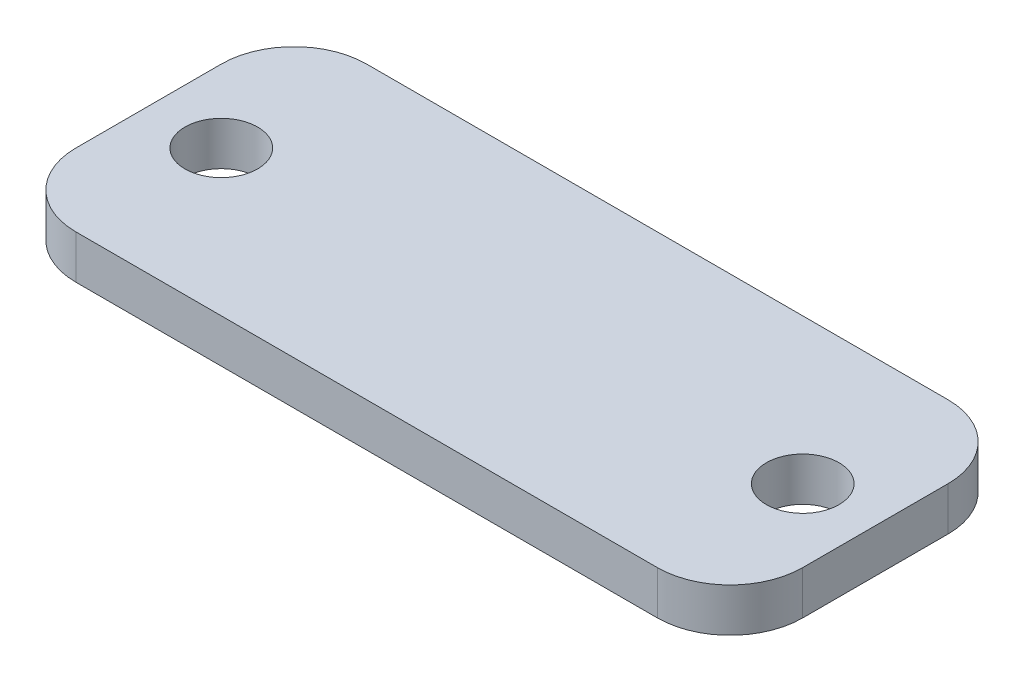
ISO-10303-21;
HEADER;
FILE_DESCRIPTION(('STEP AP214'),'2;1');
FILE_NAME('part.step','',(''),(''),'','','');
FILE_SCHEMA(('AUTOMOTIVE_DESIGN { 1 0 10303 214 1 1 1 1 }'));
ENDSEC;
DATA;
#1=APPLICATION_CONTEXT('core data for automotive mechanical design processes');
#2=APPLICATION_PROTOCOL_DEFINITION('international standard','automotive_design',2000,#1);
#3=PRODUCT_CONTEXT('',#1,'mechanical');
#4=PRODUCT('Part','Part','',(#3));
#5=PRODUCT_RELATED_PRODUCT_CATEGORY('part','',(#4));
#6=PRODUCT_DEFINITION_FORMATION('','',#4);
#7=PRODUCT_DEFINITION_CONTEXT('part definition',#1,'design');
#8=PRODUCT_DEFINITION('design','',#6,#7);
#9=PRODUCT_DEFINITION_SHAPE('','',#8);
#10=(LENGTH_UNIT() NAMED_UNIT(*) SI_UNIT(.MILLI.,.METRE.));
#11=(NAMED_UNIT(*) PLANE_ANGLE_UNIT() SI_UNIT($,.RADIAN.));
#12=(NAMED_UNIT(*) SI_UNIT($,.STERADIAN.) SOLID_ANGLE_UNIT());
#13=UNCERTAINTY_MEASURE_WITH_UNIT(LENGTH_MEASURE(1.E-05),#10,'distance_accuracy_value','');
#14=(GEOMETRIC_REPRESENTATION_CONTEXT(3) GLOBAL_UNCERTAINTY_ASSIGNED_CONTEXT((#13)) GLOBAL_UNIT_ASSIGNED_CONTEXT((#10,
#11,#12)) REPRESENTATION_CONTEXT('',''));
#15=CARTESIAN_POINT('',(0.,0.,0.));
#16=DIRECTION('',(0.,0.,1.));
#17=DIRECTION('',(1.,0.,0.));
#18=AXIS2_PLACEMENT_3D('',#15,#16,#17);
#19=CARTESIAN_POINT('',(0.,3.,0.));
#20=DIRECTION('',(0.,-1.,0.));
#21=DIRECTION('',(0.,0.,-1.));
#22=AXIS2_PLACEMENT_3D('',#19,#20,#21);
#23=PLANE('',#22);
#24=DIRECTION('',(0.,0.,1.));
#25=VECTOR('',#24,1.);
#26=CARTESIAN_POINT('',(-25.,3.,10.));
#27=LINE('',#26,#25);
#28=CARTESIAN_POINT('',(-25.,3.,-5.));
#29=VERTEX_POINT('',#28);
#30=CARTESIAN_POINT('',(-25.,3.,5.));
#31=VERTEX_POINT('',#30);
#32=EDGE_CURVE('E171',#29,#31,#27,.T.);
#33=ORIENTED_EDGE('',*,*,#32,.T.);
#34=CARTESIAN_POINT('',(-20.,3.,5.));
#35=DIRECTION('',(0.,-1.,0.));
#36=DIRECTION('',(0.,0.,-1.));
#37=AXIS2_PLACEMENT_3D('',#34,#35,#36);
#38=CIRCLE('',#37,5.);
#39=CARTESIAN_POINT('',(-20.,3.,10.));
#40=VERTEX_POINT('',#39);
#41=EDGE_CURVE('E148',#31,#40,#38,.F.);
#42=ORIENTED_EDGE('',*,*,#41,.T.);
#43=DIRECTION('',(1.,0.,0.));
#44=VECTOR('',#43,1.);
#45=CARTESIAN_POINT('',(-25.,3.,10.));
#46=LINE('',#45,#44);
#47=CARTESIAN_POINT('',(20.,3.,10.));
#48=VERTEX_POINT('',#47);
#49=EDGE_CURVE('E119',#40,#48,#46,.T.);
#50=ORIENTED_EDGE('',*,*,#49,.T.);
#51=CARTESIAN_POINT('',(20.,3.,5.));
#52=DIRECTION('',(0.,-1.,0.));
#53=DIRECTION('',(0.,0.,-1.));
#54=AXIS2_PLACEMENT_3D('',#51,#52,#53);
#55=CIRCLE('',#54,5.);
#56=CARTESIAN_POINT('',(25.,3.,5.));
#57=VERTEX_POINT('',#56);
#58=EDGE_CURVE('E144',#48,#57,#55,.F.);
#59=ORIENTED_EDGE('',*,*,#58,.T.);
#60=DIRECTION('',(0.,0.,-1.));
#61=VECTOR('',#60,1.);
#62=CARTESIAN_POINT('',(25.,3.,10.));
#63=LINE('',#62,#61);
#64=CARTESIAN_POINT('',(25.,3.,-5.));
#65=VERTEX_POINT('',#64);
#66=EDGE_CURVE('E127',#57,#65,#63,.T.);
#67=ORIENTED_EDGE('',*,*,#66,.T.);
#68=CARTESIAN_POINT('',(20.,3.,-5.));
#69=DIRECTION('',(0.,-1.,0.));
#70=DIRECTION('',(0.,0.,-1.));
#71=AXIS2_PLACEMENT_3D('',#68,#69,#70);
#72=CIRCLE('',#71,5.);
#73=CARTESIAN_POINT('',(20.,3.,-10.));
#74=VERTEX_POINT('',#73);
#75=EDGE_CURVE('E54',#65,#74,#72,.F.);
#76=ORIENTED_EDGE('',*,*,#75,.T.);
#77=DIRECTION('',(-1.,0.,0.));
#78=VECTOR('',#77,1.);
#79=CARTESIAN_POINT('',(-25.,3.,-10.));
#80=LINE('',#79,#78);
#81=CARTESIAN_POINT('',(-20.,3.,-10.));
#82=VERTEX_POINT('',#81);
#83=EDGE_CURVE('E130',#74,#82,#80,.T.);
#84=ORIENTED_EDGE('',*,*,#83,.T.);
#85=CARTESIAN_POINT('',(-20.,3.,-5.));
#86=DIRECTION('',(0.,-1.,0.));
#87=DIRECTION('',(0.,0.,-1.));
#88=AXIS2_PLACEMENT_3D('',#85,#86,#87);
#89=CIRCLE('',#88,5.);
#90=EDGE_CURVE('E146',#82,#29,#89,.F.);
#91=ORIENTED_EDGE('',*,*,#90,.T.);
#92=EDGE_LOOP('',(#33,#42,#50,#59,#67,#76,#84,#91));
#93=FACE_BOUND('',#92,.T.);
#94=CARTESIAN_POINT('',(20.,3.,0.));
#95=DIRECTION('',(0.,1.,0.));
#96=DIRECTION('',(0.,0.,1.));
#97=AXIS2_PLACEMENT_3D('',#94,#95,#96);
#98=CIRCLE('',#97,2.5);
#99=CARTESIAN_POINT('',(20.,3.,2.5));
#100=VERTEX_POINT('',#99);
#101=EDGE_CURVE('E167',#100,#100,#98,.T.);
#102=ORIENTED_EDGE('',*,*,#101,.F.);
#103=EDGE_LOOP('',(#102));
#104=FACE_BOUND('',#103,.T.);
#105=CARTESIAN_POINT('',(-20.,3.,0.));
#106=DIRECTION('',(0.,1.,0.));
#107=DIRECTION('',(0.,0.,1.));
#108=AXIS2_PLACEMENT_3D('',#105,#106,#107);
#109=CIRCLE('',#108,2.5);
#110=CARTESIAN_POINT('',(-20.,3.,2.5));
#111=VERTEX_POINT('',#110);
#112=EDGE_CURVE('E177',#111,#111,#109,.T.);
#113=ORIENTED_EDGE('',*,*,#112,.F.);
#114=EDGE_LOOP('',(#113));
#115=FACE_BOUND('',#114,.T.);
#116=ADVANCED_FACE('F32',(#93,#104,#115),#23,.F.);
#117=CARTESIAN_POINT('',(0.,0.,0.));
#118=DIRECTION('',(0.,-1.,0.));
#119=DIRECTION('',(0.,0.,-1.));
#120=AXIS2_PLACEMENT_3D('',#117,#118,#119);
#121=PLANE('',#120);
#122=CARTESIAN_POINT('',(20.,0.,0.));
#123=DIRECTION('',(0.,1.,0.));
#124=DIRECTION('',(0.,0.,1.));
#125=AXIS2_PLACEMENT_3D('',#122,#123,#124);
#126=CIRCLE('',#125,2.5);
#127=CARTESIAN_POINT('',(20.,0.,2.5));
#128=VERTEX_POINT('',#127);
#129=EDGE_CURVE('E174',#128,#128,#126,.T.);
#130=ORIENTED_EDGE('',*,*,#129,.T.);
#131=EDGE_LOOP('',(#130));
#132=FACE_BOUND('',#131,.T.);
#133=DIRECTION('',(1.,0.,0.));
#134=VECTOR('',#133,1.);
#135=CARTESIAN_POINT('',(-25.,0.,10.));
#136=LINE('',#135,#134);
#137=CARTESIAN_POINT('',(-20.,0.,10.));
#138=VERTEX_POINT('',#137);
#139=CARTESIAN_POINT('',(20.,0.,10.));
#140=VERTEX_POINT('',#139);
#141=EDGE_CURVE('E116',#138,#140,#136,.T.);
#142=ORIENTED_EDGE('',*,*,#141,.F.);
#143=CARTESIAN_POINT('',(-20.,0.,5.));
#144=DIRECTION('',(0.,-1.,0.));
#145=DIRECTION('',(0.,0.,-1.));
#146=AXIS2_PLACEMENT_3D('',#143,#144,#145);
#147=CIRCLE('',#146,5.);
#148=CARTESIAN_POINT('',(-25.,0.,5.));
#149=VERTEX_POINT('',#148);
#150=EDGE_CURVE('E99',#138,#149,#147,.T.);
#151=ORIENTED_EDGE('',*,*,#150,.T.);
#152=DIRECTION('',(0.,0.,1.));
#153=VECTOR('',#152,1.);
#154=CARTESIAN_POINT('',(-25.,0.,10.));
#155=LINE('',#154,#153);
#156=CARTESIAN_POINT('',(-25.,0.,-5.));
#157=VERTEX_POINT('',#156);
#158=EDGE_CURVE('E128',#157,#149,#155,.T.);
#159=ORIENTED_EDGE('',*,*,#158,.F.);
#160=CARTESIAN_POINT('',(-20.,0.,-5.));
#161=DIRECTION('',(0.,-1.,0.));
#162=DIRECTION('',(0.,0.,-1.));
#163=AXIS2_PLACEMENT_3D('',#160,#161,#162);
#164=CIRCLE('',#163,5.);
#165=CARTESIAN_POINT('',(-20.,0.,-10.));
#166=VERTEX_POINT('',#165);
#167=EDGE_CURVE('E110',#157,#166,#164,.T.);
#168=ORIENTED_EDGE('',*,*,#167,.T.);
#169=DIRECTION('',(-1.,0.,0.));
#170=VECTOR('',#169,1.);
#171=CARTESIAN_POINT('',(-25.,0.,-10.));
#172=LINE('',#171,#170);
#173=CARTESIAN_POINT('',(20.,0.,-10.));
#174=VERTEX_POINT('',#173);
#175=EDGE_CURVE('E132',#174,#166,#172,.T.);
#176=ORIENTED_EDGE('',*,*,#175,.F.);
#177=CARTESIAN_POINT('',(20.,0.,-5.));
#178=DIRECTION('',(0.,-1.,0.));
#179=DIRECTION('',(0.,0.,-1.));
#180=AXIS2_PLACEMENT_3D('',#177,#178,#179);
#181=CIRCLE('',#180,5.);
#182=CARTESIAN_POINT('',(25.,0.,-5.));
#183=VERTEX_POINT('',#182);
#184=EDGE_CURVE('E120',#174,#183,#181,.T.);
#185=ORIENTED_EDGE('',*,*,#184,.T.);
#186=DIRECTION('',(0.,0.,-1.));
#187=VECTOR('',#186,1.);
#188=CARTESIAN_POINT('',(25.,0.,10.));
#189=LINE('',#188,#187);
#190=CARTESIAN_POINT('',(25.,0.,5.));
#191=VERTEX_POINT('',#190);
#192=EDGE_CURVE('E159',#191,#183,#189,.T.);
#193=ORIENTED_EDGE('',*,*,#192,.F.);
#194=CARTESIAN_POINT('',(20.,0.,5.));
#195=DIRECTION('',(0.,-1.,0.));
#196=DIRECTION('',(0.,0.,-1.));
#197=AXIS2_PLACEMENT_3D('',#194,#195,#196);
#198=CIRCLE('',#197,5.);
#199=EDGE_CURVE('E126',#191,#140,#198,.T.);
#200=ORIENTED_EDGE('',*,*,#199,.T.);
#201=EDGE_LOOP('',(#142,#151,#159,#168,#176,#185,#193,#200));
#202=FACE_BOUND('',#201,.T.);
#203=CARTESIAN_POINT('',(-20.,0.,0.));
#204=DIRECTION('',(0.,1.,0.));
#205=DIRECTION('',(0.,0.,1.));
#206=AXIS2_PLACEMENT_3D('',#203,#204,#205);
#207=CIRCLE('',#206,2.5);
#208=CARTESIAN_POINT('',(-20.,0.,2.5));
#209=VERTEX_POINT('',#208);
#210=EDGE_CURVE('E180',#209,#209,#207,.T.);
#211=ORIENTED_EDGE('',*,*,#210,.T.);
#212=EDGE_LOOP('',(#211));
#213=FACE_BOUND('',#212,.T.);
#214=ADVANCED_FACE('F123',(#132,#202,#213),#121,.T.);
#215=CARTESIAN_POINT('',(25.,3.,10.));
#216=DIRECTION('',(-1.,0.,0.));
#217=DIRECTION('',(0.,0.,1.));
#218=AXIS2_PLACEMENT_3D('',#215,#216,#217);
#219=PLANE('',#218);
#220=ORIENTED_EDGE('',*,*,#66,.F.);
#221=DIRECTION('',(0.,-1.,0.));
#222=VECTOR('',#221,1.);
#223=CARTESIAN_POINT('',(25.,3.,5.));
#224=LINE('',#223,#222);
#225=EDGE_CURVE('E11',#57,#191,#224,.T.);
#226=ORIENTED_EDGE('',*,*,#225,.T.);
#227=ORIENTED_EDGE('',*,*,#192,.T.);
#228=DIRECTION('',(0.,-1.,0.));
#229=VECTOR('',#228,1.);
#230=CARTESIAN_POINT('',(25.,3.,-5.));
#231=LINE('',#230,#229);
#232=EDGE_CURVE('E40',#183,#65,#231,.F.);
#233=ORIENTED_EDGE('',*,*,#232,.T.);
#234=EDGE_LOOP('',(#220,#226,#227,#233));
#235=FACE_BOUND('',#234,.T.);
#236=ADVANCED_FACE('F157',(#235),#219,.F.);
#237=CARTESIAN_POINT('',(-25.,3.,-10.));
#238=DIRECTION('',(0.,0.,1.));
#239=DIRECTION('',(1.,0.,0.));
#240=AXIS2_PLACEMENT_3D('',#237,#238,#239);
#241=PLANE('',#240);
#242=ORIENTED_EDGE('',*,*,#175,.T.);
#243=DIRECTION('',(0.,-1.,0.));
#244=VECTOR('',#243,1.);
#245=CARTESIAN_POINT('',(-20.,3.,-10.));
#246=LINE('',#245,#244);
#247=EDGE_CURVE('E47',#166,#82,#246,.F.);
#248=ORIENTED_EDGE('',*,*,#247,.T.);
#249=ORIENTED_EDGE('',*,*,#83,.F.);
#250=DIRECTION('',(0.,-1.,0.));
#251=VECTOR('',#250,1.);
#252=CARTESIAN_POINT('',(20.,3.,-10.));
#253=LINE('',#252,#251);
#254=EDGE_CURVE('E150',#74,#174,#253,.T.);
#255=ORIENTED_EDGE('',*,*,#254,.T.);
#256=EDGE_LOOP('',(#242,#248,#249,#255));
#257=FACE_BOUND('',#256,.T.);
#258=ADVANCED_FACE('F166',(#257),#241,.F.);
#259=CARTESIAN_POINT('',(-25.,3.,10.));
#260=DIRECTION('',(1.,0.,0.));
#261=DIRECTION('',(0.,0.,-1.));
#262=AXIS2_PLACEMENT_3D('',#259,#260,#261);
#263=PLANE('',#262);
#264=ORIENTED_EDGE('',*,*,#158,.T.);
#265=DIRECTION('',(0.,-1.,0.));
#266=VECTOR('',#265,1.);
#267=CARTESIAN_POINT('',(-25.,3.,5.));
#268=LINE('',#267,#266);
#269=EDGE_CURVE('E104',#149,#31,#268,.F.);
#270=ORIENTED_EDGE('',*,*,#269,.T.);
#271=ORIENTED_EDGE('',*,*,#32,.F.);
#272=DIRECTION('',(0.,-1.,0.));
#273=VECTOR('',#272,1.);
#274=CARTESIAN_POINT('',(-25.,3.,-5.));
#275=LINE('',#274,#273);
#276=EDGE_CURVE('E109',#29,#157,#275,.T.);
#277=ORIENTED_EDGE('',*,*,#276,.T.);
#278=EDGE_LOOP('',(#264,#270,#271,#277));
#279=FACE_BOUND('',#278,.T.);
#280=ADVANCED_FACE('F202',(#279),#263,.F.);
#281=CARTESIAN_POINT('',(-25.,3.,10.));
#282=DIRECTION('',(0.,0.,-1.));
#283=DIRECTION('',(-1.,0.,0.));
#284=AXIS2_PLACEMENT_3D('',#281,#282,#283);
#285=PLANE('',#284);
#286=ORIENTED_EDGE('',*,*,#49,.F.);
#287=DIRECTION('',(0.,-1.,0.));
#288=VECTOR('',#287,1.);
#289=CARTESIAN_POINT('',(-20.,3.,10.));
#290=LINE('',#289,#288);
#291=EDGE_CURVE('E103',#40,#138,#290,.T.);
#292=ORIENTED_EDGE('',*,*,#291,.T.);
#293=ORIENTED_EDGE('',*,*,#141,.T.);
#294=DIRECTION('',(0.,-1.,0.));
#295=VECTOR('',#294,1.);
#296=CARTESIAN_POINT('',(20.,3.,10.));
#297=LINE('',#296,#295);
#298=EDGE_CURVE('E121',#140,#48,#297,.F.);
#299=ORIENTED_EDGE('',*,*,#298,.T.);
#300=EDGE_LOOP('',(#286,#292,#293,#299));
#301=FACE_BOUND('',#300,.T.);
#302=ADVANCED_FACE('F115',(#301),#285,.F.);
#303=CARTESIAN_POINT('',(20.,3.,0.));
#304=DIRECTION('',(0.,-1.,0.));
#305=DIRECTION('',(0.,0.,-1.));
#306=AXIS2_PLACEMENT_3D('',#303,#304,#305);
#307=CYLINDRICAL_SURFACE('',#306,2.5);
#308=ORIENTED_EDGE('',*,*,#101,.T.);
#309=EDGE_LOOP('',(#308));
#310=FACE_BOUND('',#309,.T.);
#311=ORIENTED_EDGE('',*,*,#129,.F.);
#312=EDGE_LOOP('',(#311));
#313=FACE_BOUND('',#312,.T.);
#314=ADVANCED_FACE('F197',(#310,#313),#307,.F.);
#315=CARTESIAN_POINT('',(-20.,3.,0.));
#316=DIRECTION('',(0.,-1.,0.));
#317=DIRECTION('',(0.,0.,-1.));
#318=AXIS2_PLACEMENT_3D('',#315,#316,#317);
#319=CYLINDRICAL_SURFACE('',#318,2.5);
#320=ORIENTED_EDGE('',*,*,#112,.T.);
#321=EDGE_LOOP('',(#320));
#322=FACE_BOUND('',#321,.T.);
#323=ORIENTED_EDGE('',*,*,#210,.F.);
#324=EDGE_LOOP('',(#323));
#325=FACE_BOUND('',#324,.T.);
#326=ADVANCED_FACE('F186',(#322,#325),#319,.F.);
#327=CARTESIAN_POINT('',(-20.,3.,5.));
#328=DIRECTION('',(0.,-1.,0.));
#329=DIRECTION('',(0.,0.,-1.));
#330=AXIS2_PLACEMENT_3D('',#327,#328,#329);
#331=CYLINDRICAL_SURFACE('',#330,5.);
#332=ORIENTED_EDGE('',*,*,#41,.F.);
#333=ORIENTED_EDGE('',*,*,#269,.F.);
#334=ORIENTED_EDGE('',*,*,#150,.F.);
#335=ORIENTED_EDGE('',*,*,#291,.F.);
#336=EDGE_LOOP('',(#332,#333,#334,#335));
#337=FACE_BOUND('',#336,.T.);
#338=ADVANCED_FACE('F102',(#337),#331,.T.);
#339=CARTESIAN_POINT('',(-20.,3.,-5.));
#340=DIRECTION('',(0.,-1.,0.));
#341=DIRECTION('',(0.,0.,-1.));
#342=AXIS2_PLACEMENT_3D('',#339,#340,#341);
#343=CYLINDRICAL_SURFACE('',#342,5.);
#344=ORIENTED_EDGE('',*,*,#90,.F.);
#345=ORIENTED_EDGE('',*,*,#247,.F.);
#346=ORIENTED_EDGE('',*,*,#167,.F.);
#347=ORIENTED_EDGE('',*,*,#276,.F.);
#348=EDGE_LOOP('',(#344,#345,#346,#347));
#349=FACE_BOUND('',#348,.T.);
#350=ADVANCED_FACE('F212',(#349),#343,.T.);
#351=CARTESIAN_POINT('',(20.,3.,5.));
#352=DIRECTION('',(0.,-1.,0.));
#353=DIRECTION('',(0.,0.,-1.));
#354=AXIS2_PLACEMENT_3D('',#351,#352,#353);
#355=CYLINDRICAL_SURFACE('',#354,5.);
#356=ORIENTED_EDGE('',*,*,#58,.F.);
#357=ORIENTED_EDGE('',*,*,#298,.F.);
#358=ORIENTED_EDGE('',*,*,#199,.F.);
#359=ORIENTED_EDGE('',*,*,#225,.F.);
#360=EDGE_LOOP('',(#356,#357,#358,#359));
#361=FACE_BOUND('',#360,.T.);
#362=ADVANCED_FACE('F214',(#361),#355,.T.);
#363=CARTESIAN_POINT('',(20.,3.,-5.));
#364=DIRECTION('',(0.,-1.,0.));
#365=DIRECTION('',(0.,0.,-1.));
#366=AXIS2_PLACEMENT_3D('',#363,#364,#365);
#367=CYLINDRICAL_SURFACE('',#366,5.);
#368=ORIENTED_EDGE('',*,*,#75,.F.);
#369=ORIENTED_EDGE('',*,*,#232,.F.);
#370=ORIENTED_EDGE('',*,*,#184,.F.);
#371=ORIENTED_EDGE('',*,*,#254,.F.);
#372=EDGE_LOOP('',(#368,#369,#370,#371));
#373=FACE_BOUND('',#372,.T.);
#374=ADVANCED_FACE('F34',(#373),#367,.T.);
#375=CLOSED_SHELL('',(#116,#214,#236,#258,#280,#302,#314,#326,#338,#350,#362,#374));
#376=MANIFOLD_SOLID_BREP('B2',#375);
#377=ADVANCED_BREP_SHAPE_REPRESENTATION('',(#18,#376),#14);
#378=SHAPE_DEFINITION_REPRESENTATION(#9,#377);
ENDSEC;
END-ISO-10303-21;
